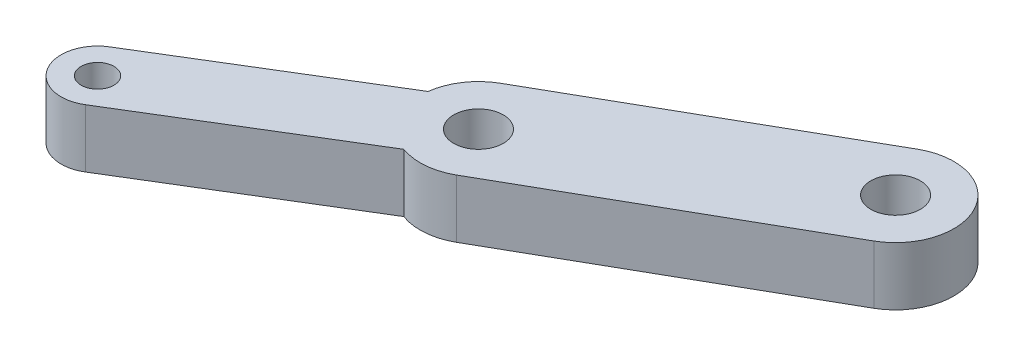
ISO-10303-21;
HEADER;
FILE_DESCRIPTION(('STEP AP214'),'2;1');
FILE_NAME('part.step','',(''),(''),'','','');
FILE_SCHEMA(('AUTOMOTIVE_DESIGN { 1 0 10303 214 1 1 1 1 }'));
ENDSEC;
DATA;
#1=APPLICATION_CONTEXT('core data for automotive mechanical design processes');
#2=APPLICATION_PROTOCOL_DEFINITION('international standard','automotive_design',2000,#1);
#3=PRODUCT_CONTEXT('',#1,'mechanical');
#4=PRODUCT('Part','Part','',(#3));
#5=PRODUCT_RELATED_PRODUCT_CATEGORY('part','',(#4));
#6=PRODUCT_DEFINITION_FORMATION('','',#4);
#7=PRODUCT_DEFINITION_CONTEXT('part definition',#1,'design');
#8=PRODUCT_DEFINITION('design','',#6,#7);
#9=PRODUCT_DEFINITION_SHAPE('','',#8);
#10=(LENGTH_UNIT() NAMED_UNIT(*) SI_UNIT(.MILLI.,.METRE.));
#11=(NAMED_UNIT(*) PLANE_ANGLE_UNIT() SI_UNIT($,.RADIAN.));
#12=(NAMED_UNIT(*) SI_UNIT($,.STERADIAN.) SOLID_ANGLE_UNIT());
#13=UNCERTAINTY_MEASURE_WITH_UNIT(LENGTH_MEASURE(1.E-05),#10,'distance_accuracy_value','');
#14=(GEOMETRIC_REPRESENTATION_CONTEXT(3) GLOBAL_UNCERTAINTY_ASSIGNED_CONTEXT((#13)) GLOBAL_UNIT_ASSIGNED_CONTEXT((#10,
#11,#12)) REPRESENTATION_CONTEXT('',''));
#15=CARTESIAN_POINT('',(0.,0.,0.));
#16=DIRECTION('',(0.,0.,1.));
#17=DIRECTION('',(1.,0.,0.));
#18=AXIS2_PLACEMENT_3D('',#15,#16,#17);
#19=CARTESIAN_POINT('',(-0.559805616051686,4.,-3.53683238174897));
#20=DIRECTION('',(0.,1.,0.));
#21=DIRECTION('',(0.,0.,1.));
#22=AXIS2_PLACEMENT_3D('',#19,#20,#21);
#23=PLANE('',#22);
#24=CARTESIAN_POINT('',(33.903283157059,4.,-23.8248844133164));
#25=DIRECTION('',(0.,1.,0.));
#26=DIRECTION('',(0.,0.,1.));
#27=AXIS2_PLACEMENT_3D('',#24,#25,#26);
#28=CIRCLE('',#27,1.7);
#29=CARTESIAN_POINT('',(33.903283157059,4.,-22.1248844133164));
#30=VERTEX_POINT('',#29);
#31=EDGE_CURVE('E182',#30,#30,#28,.T.);
#32=ORIENTED_EDGE('',*,*,#31,.F.);
#33=EDGE_LOOP('',(#32));
#34=FACE_BOUND('',#33,.T.);
#35=CARTESIAN_POINT('',(-0.559805616051686,4.,-3.53683238174897));
#36=DIRECTION('',(0.,1.,0.));
#37=DIRECTION('',(0.,0.,1.));
#38=AXIS2_PLACEMENT_3D('',#35,#36,#37);
#39=CIRCLE('',#38,2.5);
#40=CARTESIAN_POINT('',(-1.86103218645981,4.,-5.67150083667679));
#41=VERTEX_POINT('',#40);
#42=CARTESIAN_POINT('',(0.741420954356441,4.,-1.40216392682116));
#43=VERTEX_POINT('',#42);
#44=EDGE_CURVE('E145',#41,#43,#39,.T.);
#45=ORIENTED_EDGE('',*,*,#44,.T.);
#46=DIRECTION('',(0.853867381971126,0.,-0.520490628163251));
#47=VECTOR('',#46,1.);
#48=CARTESIAN_POINT('',(0.741420954356441,4.,-1.40216392682116));
#49=LINE('',#48,#47);
#50=CARTESIAN_POINT('',(14.3122627605066,4.,-9.67452111662429));
#51=VERTEX_POINT('',#50);
#52=EDGE_CURVE('E92',#43,#51,#49,.T.);
#53=ORIENTED_EDGE('',*,*,#52,.T.);
#54=CARTESIAN_POINT('',(15.6772362357522,4.,-13.4344210370844));
#55=DIRECTION('',(0.,1.,0.));
#56=DIRECTION('',(0.,0.,1.));
#57=AXIS2_PLACEMENT_3D('',#54,#55,#56);
#58=CIRCLE('',#57,4.);
#59=CARTESIAN_POINT('',(17.6582810488637,4.,-9.95944456976206));
#60=VERTEX_POINT('',#59);
#61=EDGE_CURVE('E160',#51,#60,#58,.T.);
#62=ORIENTED_EDGE('',*,*,#61,.T.);
#63=DIRECTION('',(0.868744116830589,0.,-0.495261203277867));
#64=VECTOR('',#63,1.);
#65=CARTESIAN_POINT('',(17.6582810488637,4.,-9.95944456976206));
#66=LINE('',#65,#64);
#67=CARTESIAN_POINT('',(35.8843279701704,4.,-20.3499079459941));
#68=VERTEX_POINT('',#67);
#69=EDGE_CURVE('E173',#60,#68,#66,.T.);
#70=ORIENTED_EDGE('',*,*,#69,.T.);
#71=CARTESIAN_POINT('',(33.903283157059,4.,-23.8248844133164));
#72=DIRECTION('',(0.,1.,0.));
#73=DIRECTION('',(0.,0.,1.));
#74=AXIS2_PLACEMENT_3D('',#71,#72,#73);
#75=CIRCLE('',#74,4.);
#76=CARTESIAN_POINT('',(31.9222383439475,4.,-27.2998608806388));
#77=VERTEX_POINT('',#76);
#78=EDGE_CURVE('E111',#68,#77,#75,.T.);
#79=ORIENTED_EDGE('',*,*,#78,.T.);
#80=DIRECTION('',(-0.868744116830589,0.,0.495261203277866));
#81=VECTOR('',#80,1.);
#82=CARTESIAN_POINT('',(13.6961914226407,4.,-16.9093975044068));
#83=LINE('',#82,#81);
#84=CARTESIAN_POINT('',(13.6961914226407,4.,-16.9093975044068));
#85=VERTEX_POINT('',#84);
#86=EDGE_CURVE('E105',#77,#85,#83,.T.);
#87=ORIENTED_EDGE('',*,*,#86,.T.);
#88=CARTESIAN_POINT('',(15.6772362357522,4.,-13.4344210370844));
#89=DIRECTION('',(0.,1.,0.));
#90=DIRECTION('',(0.,0.,1.));
#91=AXIS2_PLACEMENT_3D('',#88,#89,#90);
#92=CIRCLE('',#91,4.);
#93=CARTESIAN_POINT('',(11.7098096196904,4.,-13.9438580264799));
#94=VERTEX_POINT('',#93);
#95=EDGE_CURVE('E109',#85,#94,#92,.T.);
#96=ORIENTED_EDGE('',*,*,#95,.T.);
#97=DIRECTION('',(-0.853867381971126,0.,0.520490628163251));
#98=VECTOR('',#97,1.);
#99=CARTESIAN_POINT('',(-1.86103218645981,4.,-5.67150083667679));
#100=LINE('',#99,#98);
#101=EDGE_CURVE('E50',#94,#41,#100,.T.);
#102=ORIENTED_EDGE('',*,*,#101,.T.);
#103=EDGE_LOOP('',(#45,#53,#62,#70,#79,#87,#96,#102));
#104=FACE_BOUND('',#103,.T.);
#105=CARTESIAN_POINT('',(15.6772362357522,4.,-13.4344210370844));
#106=DIRECTION('',(0.,1.,0.));
#107=DIRECTION('',(0.,0.,1.));
#108=AXIS2_PLACEMENT_3D('',#105,#106,#107);
#109=CIRCLE('',#108,1.7);
#110=CARTESIAN_POINT('',(15.6772362357522,4.,-11.7344210370844));
#111=VERTEX_POINT('',#110);
#112=EDGE_CURVE('E134',#111,#111,#109,.T.);
#113=ORIENTED_EDGE('',*,*,#112,.F.);
#114=EDGE_LOOP('',(#113));
#115=FACE_BOUND('',#114,.T.);
#116=CARTESIAN_POINT('',(-0.559805616051686,4.,-3.53683238174897));
#117=DIRECTION('',(0.,1.,0.));
#118=DIRECTION('',(0.,0.,1.));
#119=AXIS2_PLACEMENT_3D('',#116,#117,#118);
#120=CIRCLE('',#119,1.125);
#121=CARTESIAN_POINT('',(-0.559805616051686,4.,-2.41183238174897));
#122=VERTEX_POINT('',#121);
#123=EDGE_CURVE('E188',#122,#122,#120,.T.);
#124=ORIENTED_EDGE('',*,*,#123,.F.);
#125=EDGE_LOOP('',(#124));
#126=FACE_BOUND('',#125,.T.);
#127=ADVANCED_FACE('F33',(#34,#104,#115,#126),#23,.T.);
#128=CARTESIAN_POINT('',(-0.559805616051686,0.,-3.53683238174897));
#129=DIRECTION('',(0.,1.,0.));
#130=DIRECTION('',(0.,0.,1.));
#131=AXIS2_PLACEMENT_3D('',#128,#129,#130);
#132=PLANE('',#131);
#133=CARTESIAN_POINT('',(-0.559805616051686,0.,-3.53683238174897));
#134=DIRECTION('',(0.,1.,0.));
#135=DIRECTION('',(0.,0.,1.));
#136=AXIS2_PLACEMENT_3D('',#133,#134,#135);
#137=CIRCLE('',#136,2.5);
#138=CARTESIAN_POINT('',(-1.86103218645981,0.,-5.67150083667679));
#139=VERTEX_POINT('',#138);
#140=CARTESIAN_POINT('',(0.741420954356441,0.,-1.40216392682116));
#141=VERTEX_POINT('',#140);
#142=EDGE_CURVE('E130',#139,#141,#137,.T.);
#143=ORIENTED_EDGE('',*,*,#142,.F.);
#144=DIRECTION('',(-0.853867381971126,0.,0.520490628163251));
#145=VECTOR('',#144,1.);
#146=CARTESIAN_POINT('',(-1.86103218645981,0.,-5.67150083667679));
#147=LINE('',#146,#145);
#148=CARTESIAN_POINT('',(11.7098096196904,0.,-13.9438580264799));
#149=VERTEX_POINT('',#148);
#150=EDGE_CURVE('E84',#149,#139,#147,.T.);
#151=ORIENTED_EDGE('',*,*,#150,.F.);
#152=CARTESIAN_POINT('',(15.6772362357522,0.,-13.4344210370844));
#153=DIRECTION('',(0.,1.,0.));
#154=DIRECTION('',(0.,0.,1.));
#155=AXIS2_PLACEMENT_3D('',#152,#153,#154);
#156=CIRCLE('',#155,4.);
#157=CARTESIAN_POINT('',(13.6961914226407,0.,-16.9093975044068));
#158=VERTEX_POINT('',#157);
#159=EDGE_CURVE('E78',#158,#149,#156,.T.);
#160=ORIENTED_EDGE('',*,*,#159,.F.);
#161=DIRECTION('',(-0.868744116830589,0.,0.495261203277866));
#162=VECTOR('',#161,1.);
#163=CARTESIAN_POINT('',(13.6961914226407,0.,-16.9093975044068));
#164=LINE('',#163,#162);
#165=CARTESIAN_POINT('',(31.9222383439475,0.,-27.2998608806388));
#166=VERTEX_POINT('',#165);
#167=EDGE_CURVE('E120',#166,#158,#164,.T.);
#168=ORIENTED_EDGE('',*,*,#167,.F.);
#169=CARTESIAN_POINT('',(33.903283157059,0.,-23.8248844133164));
#170=DIRECTION('',(0.,1.,0.));
#171=DIRECTION('',(0.,0.,1.));
#172=AXIS2_PLACEMENT_3D('',#169,#170,#171);
#173=CIRCLE('',#172,4.);
#174=CARTESIAN_POINT('',(35.8843279701704,0.,-20.3499079459941));
#175=VERTEX_POINT('',#174);
#176=EDGE_CURVE('E140',#175,#166,#173,.T.);
#177=ORIENTED_EDGE('',*,*,#176,.F.);
#178=DIRECTION('',(0.868744116830589,0.,-0.495261203277867));
#179=VECTOR('',#178,1.);
#180=CARTESIAN_POINT('',(17.6582810488637,0.,-9.95944456976206));
#181=LINE('',#180,#179);
#182=CARTESIAN_POINT('',(17.6582810488637,0.,-9.95944456976206));
#183=VERTEX_POINT('',#182);
#184=EDGE_CURVE('E138',#183,#175,#181,.T.);
#185=ORIENTED_EDGE('',*,*,#184,.F.);
#186=CARTESIAN_POINT('',(15.6772362357522,0.,-13.4344210370844));
#187=DIRECTION('',(0.,1.,0.));
#188=DIRECTION('',(0.,0.,1.));
#189=AXIS2_PLACEMENT_3D('',#186,#187,#188);
#190=CIRCLE('',#189,4.);
#191=CARTESIAN_POINT('',(14.3122627605066,0.,-9.67452111662429));
#192=VERTEX_POINT('',#191);
#193=EDGE_CURVE('E136',#192,#183,#190,.T.);
#194=ORIENTED_EDGE('',*,*,#193,.F.);
#195=DIRECTION('',(0.853867381971126,0.,-0.520490628163251));
#196=VECTOR('',#195,1.);
#197=CARTESIAN_POINT('',(0.741420954356441,0.,-1.40216392682116));
#198=LINE('',#197,#196);
#199=EDGE_CURVE('E133',#141,#192,#198,.T.);
#200=ORIENTED_EDGE('',*,*,#199,.F.);
#201=EDGE_LOOP('',(#143,#151,#160,#168,#177,#185,#194,#200));
#202=FACE_BOUND('',#201,.T.);
#203=CARTESIAN_POINT('',(15.6772362357522,0.,-13.4344210370844));
#204=DIRECTION('',(0.,1.,0.));
#205=DIRECTION('',(0.,0.,1.));
#206=AXIS2_PLACEMENT_3D('',#203,#204,#205);
#207=CIRCLE('',#206,1.7);
#208=CARTESIAN_POINT('',(15.6772362357522,0.,-11.7344210370844));
#209=VERTEX_POINT('',#208);
#210=EDGE_CURVE('E179',#209,#209,#207,.T.);
#211=ORIENTED_EDGE('',*,*,#210,.T.);
#212=EDGE_LOOP('',(#211));
#213=FACE_BOUND('',#212,.T.);
#214=CARTESIAN_POINT('',(33.903283157059,0.,-23.8248844133164));
#215=DIRECTION('',(0.,1.,0.));
#216=DIRECTION('',(0.,0.,1.));
#217=AXIS2_PLACEMENT_3D('',#214,#215,#216);
#218=CIRCLE('',#217,1.7);
#219=CARTESIAN_POINT('',(33.903283157059,0.,-22.1248844133164));
#220=VERTEX_POINT('',#219);
#221=EDGE_CURVE('E185',#220,#220,#218,.T.);
#222=ORIENTED_EDGE('',*,*,#221,.T.);
#223=EDGE_LOOP('',(#222));
#224=FACE_BOUND('',#223,.T.);
#225=CARTESIAN_POINT('',(-0.559805616051686,0.,-3.53683238174897));
#226=DIRECTION('',(0.,1.,0.));
#227=DIRECTION('',(0.,0.,1.));
#228=AXIS2_PLACEMENT_3D('',#225,#226,#227);
#229=CIRCLE('',#228,1.125);
#230=CARTESIAN_POINT('',(-0.559805616051686,0.,-2.41183238174897));
#231=VERTEX_POINT('',#230);
#232=EDGE_CURVE('E191',#231,#231,#229,.T.);
#233=ORIENTED_EDGE('',*,*,#232,.T.);
#234=EDGE_LOOP('',(#233));
#235=FACE_BOUND('',#234,.T.);
#236=ADVANCED_FACE('F164',(#202,#213,#224,#235),#132,.F.);
#237=CARTESIAN_POINT('',(-0.559805616051686,4.,-3.53683238174897));
#238=DIRECTION('',(0.,-1.,0.));
#239=DIRECTION('',(0.,0.,-1.));
#240=AXIS2_PLACEMENT_3D('',#237,#238,#239);
#241=CYLINDRICAL_SURFACE('',#240,2.5);
#242=ORIENTED_EDGE('',*,*,#142,.T.);
#243=DIRECTION('',(0.,-1.,0.));
#244=VECTOR('',#243,1.);
#245=CARTESIAN_POINT('',(0.741420954356441,4.,-1.40216392682116));
#246=LINE('',#245,#244);
#247=EDGE_CURVE('E11',#43,#141,#246,.T.);
#248=ORIENTED_EDGE('',*,*,#247,.F.);
#249=ORIENTED_EDGE('',*,*,#44,.F.);
#250=DIRECTION('',(0.,-1.,0.));
#251=VECTOR('',#250,1.);
#252=CARTESIAN_POINT('',(-1.86103218645981,4.,-5.67150083667679));
#253=LINE('',#252,#251);
#254=EDGE_CURVE('E126',#41,#139,#253,.T.);
#255=ORIENTED_EDGE('',*,*,#254,.T.);
#256=EDGE_LOOP('',(#242,#248,#249,#255));
#257=FACE_BOUND('',#256,.T.);
#258=ADVANCED_FACE('F35',(#257),#241,.T.);
#259=CARTESIAN_POINT('',(0.741420954356441,4.,-1.40216392682116));
#260=DIRECTION('',(-0.520490628163251,0.,-0.853867381971126));
#261=DIRECTION('',(-0.853867381971126,0.,0.520490628163251));
#262=AXIS2_PLACEMENT_3D('',#259,#260,#261);
#263=PLANE('',#262);
#264=ORIENTED_EDGE('',*,*,#199,.T.);
#265=DIRECTION('',(0.,-1.,0.));
#266=VECTOR('',#265,1.);
#267=CARTESIAN_POINT('',(14.3122627605066,4.,-9.67452111662429));
#268=LINE('',#267,#266);
#269=EDGE_CURVE('E42',#51,#192,#268,.T.);
#270=ORIENTED_EDGE('',*,*,#269,.F.);
#271=ORIENTED_EDGE('',*,*,#52,.F.);
#272=ORIENTED_EDGE('',*,*,#247,.T.);
#273=EDGE_LOOP('',(#264,#270,#271,#272));
#274=FACE_BOUND('',#273,.T.);
#275=ADVANCED_FACE('F224',(#274),#263,.F.);
#276=CARTESIAN_POINT('',(15.6772362357522,4.,-13.4344210370844));
#277=DIRECTION('',(0.,-1.,0.));
#278=DIRECTION('',(0.,0.,-1.));
#279=AXIS2_PLACEMENT_3D('',#276,#277,#278);
#280=CYLINDRICAL_SURFACE('',#279,4.);
#281=ORIENTED_EDGE('',*,*,#193,.T.);
#282=DIRECTION('',(0.,-1.,0.));
#283=VECTOR('',#282,1.);
#284=CARTESIAN_POINT('',(17.6582810488637,4.,-9.95944456976206));
#285=LINE('',#284,#283);
#286=EDGE_CURVE('E152',#60,#183,#285,.T.);
#287=ORIENTED_EDGE('',*,*,#286,.F.);
#288=ORIENTED_EDGE('',*,*,#61,.F.);
#289=ORIENTED_EDGE('',*,*,#269,.T.);
#290=EDGE_LOOP('',(#281,#287,#288,#289));
#291=FACE_BOUND('',#290,.T.);
#292=ADVANCED_FACE('F158',(#291),#280,.T.);
#293=CARTESIAN_POINT('',(17.6582810488637,4.,-9.95944456976206));
#294=DIRECTION('',(-0.495261203277867,0.,-0.868744116830589));
#295=DIRECTION('',(-0.868744116830589,0.,0.495261203277867));
#296=AXIS2_PLACEMENT_3D('',#293,#294,#295);
#297=PLANE('',#296);
#298=ORIENTED_EDGE('',*,*,#184,.T.);
#299=DIRECTION('',(0.,-1.,0.));
#300=VECTOR('',#299,1.);
#301=CARTESIAN_POINT('',(35.8843279701704,4.,-20.3499079459941));
#302=LINE('',#301,#300);
#303=EDGE_CURVE('E149',#68,#175,#302,.T.);
#304=ORIENTED_EDGE('',*,*,#303,.F.);
#305=ORIENTED_EDGE('',*,*,#69,.F.);
#306=ORIENTED_EDGE('',*,*,#286,.T.);
#307=EDGE_LOOP('',(#298,#304,#305,#306));
#308=FACE_BOUND('',#307,.T.);
#309=ADVANCED_FACE('F169',(#308),#297,.F.);
#310=CARTESIAN_POINT('',(33.903283157059,4.,-23.8248844133164));
#311=DIRECTION('',(0.,-1.,0.));
#312=DIRECTION('',(0.,0.,-1.));
#313=AXIS2_PLACEMENT_3D('',#310,#311,#312);
#314=CYLINDRICAL_SURFACE('',#313,4.);
#315=ORIENTED_EDGE('',*,*,#176,.T.);
#316=DIRECTION('',(0.,-1.,0.));
#317=VECTOR('',#316,1.);
#318=CARTESIAN_POINT('',(31.9222383439475,4.,-27.2998608806388));
#319=LINE('',#318,#317);
#320=EDGE_CURVE('E121',#77,#166,#319,.T.);
#321=ORIENTED_EDGE('',*,*,#320,.F.);
#322=ORIENTED_EDGE('',*,*,#78,.F.);
#323=ORIENTED_EDGE('',*,*,#303,.T.);
#324=EDGE_LOOP('',(#315,#321,#322,#323));
#325=FACE_BOUND('',#324,.T.);
#326=ADVANCED_FACE('F172',(#325),#314,.T.);
#327=CARTESIAN_POINT('',(13.6961914226407,4.,-16.9093975044068));
#328=DIRECTION('',(0.495261203277866,0.,0.868744116830589));
#329=DIRECTION('',(0.868744116830589,0.,-0.495261203277866));
#330=AXIS2_PLACEMENT_3D('',#327,#328,#329);
#331=PLANE('',#330);
#332=ORIENTED_EDGE('',*,*,#167,.T.);
#333=DIRECTION('',(0.,-1.,0.));
#334=VECTOR('',#333,1.);
#335=CARTESIAN_POINT('',(13.6961914226407,4.,-16.9093975044068));
#336=LINE('',#335,#334);
#337=EDGE_CURVE('E117',#85,#158,#336,.T.);
#338=ORIENTED_EDGE('',*,*,#337,.F.);
#339=ORIENTED_EDGE('',*,*,#86,.F.);
#340=ORIENTED_EDGE('',*,*,#320,.T.);
#341=EDGE_LOOP('',(#332,#338,#339,#340));
#342=FACE_BOUND('',#341,.T.);
#343=ADVANCED_FACE('F118',(#342),#331,.F.);
#344=CARTESIAN_POINT('',(15.6772362357522,4.,-13.4344210370844));
#345=DIRECTION('',(0.,-1.,0.));
#346=DIRECTION('',(0.,0.,-1.));
#347=AXIS2_PLACEMENT_3D('',#344,#345,#346);
#348=CYLINDRICAL_SURFACE('',#347,4.);
#349=ORIENTED_EDGE('',*,*,#159,.T.);
#350=DIRECTION('',(0.,-1.,0.));
#351=VECTOR('',#350,1.);
#352=CARTESIAN_POINT('',(11.7098096196904,4.,-13.9438580264799));
#353=LINE('',#352,#351);
#354=EDGE_CURVE('E122',#94,#149,#353,.T.);
#355=ORIENTED_EDGE('',*,*,#354,.F.);
#356=ORIENTED_EDGE('',*,*,#95,.F.);
#357=ORIENTED_EDGE('',*,*,#337,.T.);
#358=EDGE_LOOP('',(#349,#355,#356,#357));
#359=FACE_BOUND('',#358,.T.);
#360=ADVANCED_FACE('F124',(#359),#348,.T.);
#361=CARTESIAN_POINT('',(-1.86103218645981,4.,-5.67150083667679));
#362=DIRECTION('',(0.520490628163251,0.,0.853867381971126));
#363=DIRECTION('',(0.853867381971126,0.,-0.520490628163251));
#364=AXIS2_PLACEMENT_3D('',#361,#362,#363);
#365=PLANE('',#364);
#366=ORIENTED_EDGE('',*,*,#150,.T.);
#367=ORIENTED_EDGE('',*,*,#254,.F.);
#368=ORIENTED_EDGE('',*,*,#101,.F.);
#369=ORIENTED_EDGE('',*,*,#354,.T.);
#370=EDGE_LOOP('',(#366,#367,#368,#369));
#371=FACE_BOUND('',#370,.T.);
#372=ADVANCED_FACE('F212',(#371),#365,.F.);
#373=CARTESIAN_POINT('',(15.6772362357522,4.,-13.4344210370844));
#374=DIRECTION('',(0.,-1.,0.));
#375=DIRECTION('',(0.,0.,-1.));
#376=AXIS2_PLACEMENT_3D('',#373,#374,#375);
#377=CYLINDRICAL_SURFACE('',#376,1.7);
#378=ORIENTED_EDGE('',*,*,#112,.T.);
#379=EDGE_LOOP('',(#378));
#380=FACE_BOUND('',#379,.T.);
#381=ORIENTED_EDGE('',*,*,#210,.F.);
#382=EDGE_LOOP('',(#381));
#383=FACE_BOUND('',#382,.T.);
#384=ADVANCED_FACE('F209',(#380,#383),#377,.F.);
#385=CARTESIAN_POINT('',(33.903283157059,4.,-23.8248844133164));
#386=DIRECTION('',(0.,-1.,0.));
#387=DIRECTION('',(0.,0.,-1.));
#388=AXIS2_PLACEMENT_3D('',#385,#386,#387);
#389=CYLINDRICAL_SURFACE('',#388,1.7);
#390=ORIENTED_EDGE('',*,*,#31,.T.);
#391=EDGE_LOOP('',(#390));
#392=FACE_BOUND('',#391,.T.);
#393=ORIENTED_EDGE('',*,*,#221,.F.);
#394=EDGE_LOOP('',(#393));
#395=FACE_BOUND('',#394,.T.);
#396=ADVANCED_FACE('F291',(#392,#395),#389,.F.);
#397=CARTESIAN_POINT('',(-0.559805616051686,4.,-3.53683238174897));
#398=DIRECTION('',(0.,-1.,0.));
#399=DIRECTION('',(0.,0.,-1.));
#400=AXIS2_PLACEMENT_3D('',#397,#398,#399);
#401=CYLINDRICAL_SURFACE('',#400,1.125);
#402=ORIENTED_EDGE('',*,*,#123,.T.);
#403=EDGE_LOOP('',(#402));
#404=FACE_BOUND('',#403,.T.);
#405=ORIENTED_EDGE('',*,*,#232,.F.);
#406=EDGE_LOOP('',(#405));
#407=FACE_BOUND('',#406,.T.);
#408=ADVANCED_FACE('F197',(#404,#407),#401,.F.);
#409=CLOSED_SHELL('',(#127,#236,#258,#275,#292,#309,#326,#343,#360,#372,#384,#396,#408));
#410=MANIFOLD_SOLID_BREP('B2',#409);
#411=ADVANCED_BREP_SHAPE_REPRESENTATION('',(#18,#410),#14);
#412=SHAPE_DEFINITION_REPRESENTATION(#9,#411);
ENDSEC;
END-ISO-10303-21;
